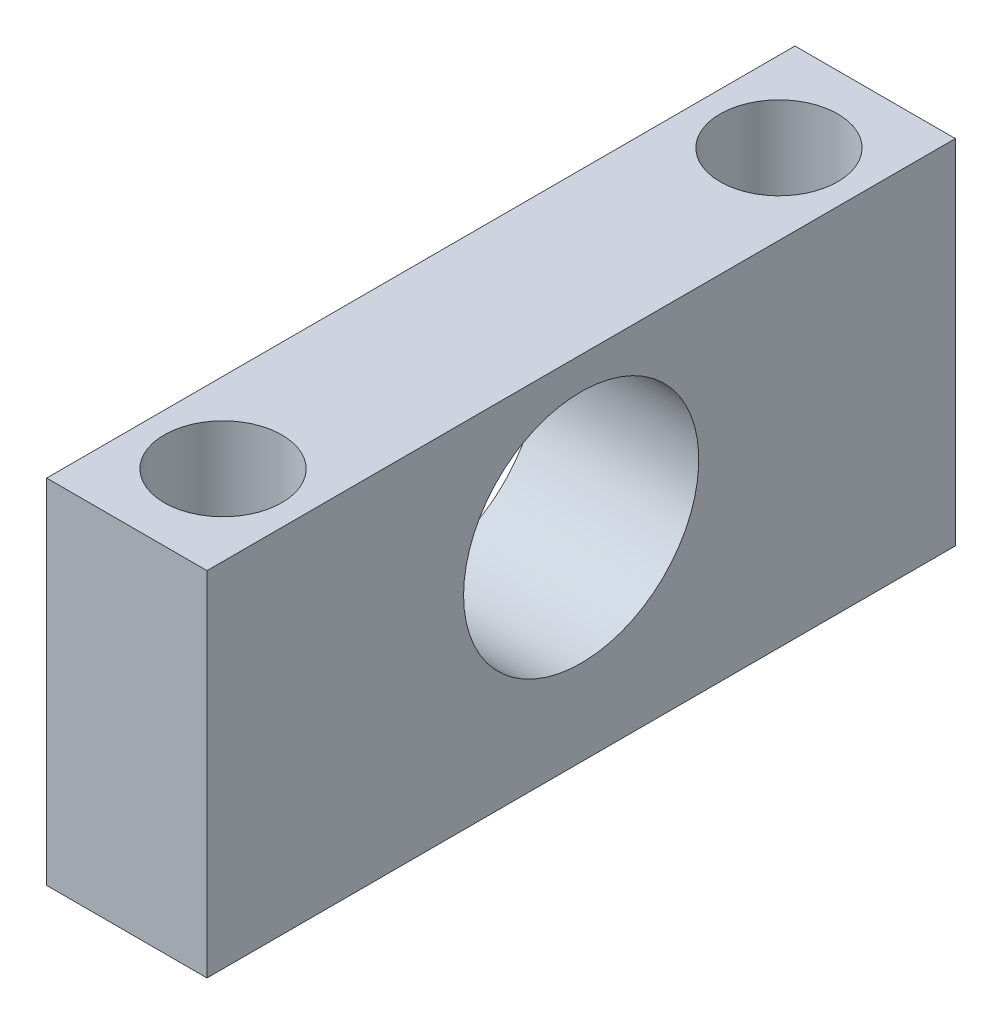
ISO-10303-21;
HEADER;
FILE_DESCRIPTION(('STEP AP214'),'2;1');
FILE_NAME('part.step','',(''),(''),'','','');
FILE_SCHEMA(('AUTOMOTIVE_DESIGN { 1 0 10303 214 1 1 1 1 }'));
ENDSEC;
DATA;
#1=APPLICATION_CONTEXT('core data for automotive mechanical design processes');
#2=APPLICATION_PROTOCOL_DEFINITION('international standard','automotive_design',2000,#1);
#3=PRODUCT_CONTEXT('',#1,'mechanical');
#4=PRODUCT('Part','Part','',(#3));
#5=PRODUCT_RELATED_PRODUCT_CATEGORY('part','',(#4));
#6=PRODUCT_DEFINITION_FORMATION('','',#4);
#7=PRODUCT_DEFINITION_CONTEXT('part definition',#1,'design');
#8=PRODUCT_DEFINITION('design','',#6,#7);
#9=PRODUCT_DEFINITION_SHAPE('','',#8);
#10=(LENGTH_UNIT() NAMED_UNIT(*) SI_UNIT(.MILLI.,.METRE.));
#11=(NAMED_UNIT(*) PLANE_ANGLE_UNIT() SI_UNIT($,.RADIAN.));
#12=(NAMED_UNIT(*) SI_UNIT($,.STERADIAN.) SOLID_ANGLE_UNIT());
#13=UNCERTAINTY_MEASURE_WITH_UNIT(LENGTH_MEASURE(1.E-05),#10,'distance_accuracy_value','');
#14=(GEOMETRIC_REPRESENTATION_CONTEXT(3) GLOBAL_UNCERTAINTY_ASSIGNED_CONTEXT((#13)) GLOBAL_UNIT_ASSIGNED_CONTEXT((#10,
#11,#12)) REPRESENTATION_CONTEXT('',''));
#15=CARTESIAN_POINT('',(0.,0.,0.));
#16=DIRECTION('',(0.,0.,1.));
#17=DIRECTION('',(1.,0.,0.));
#18=AXIS2_PLACEMENT_3D('',#15,#16,#17);
#19=CARTESIAN_POINT('',(0.,0.,35.));
#20=DIRECTION('',(0.,0.,1.));
#21=DIRECTION('',(1.,0.,0.));
#22=AXIS2_PLACEMENT_3D('',#19,#20,#21);
#23=PLANE('',#22);
#24=DIRECTION('',(1.,0.,0.));
#25=VECTOR('',#24,1.);
#26=CARTESIAN_POINT('',(0.,14.,35.));
#27=LINE('',#26,#25);
#28=CARTESIAN_POINT('',(2.5,14.,35.));
#29=VERTEX_POINT('',#28);
#30=CARTESIAN_POINT('',(17.5,14.,35.));
#31=VERTEX_POINT('',#30);
#32=EDGE_CURVE('E70',#29,#31,#27,.T.);
#33=ORIENTED_EDGE('',*,*,#32,.F.);
#34=DIRECTION('',(0.,-1.,0.));
#35=VECTOR('',#34,1.);
#36=CARTESIAN_POINT('',(2.5,17.5,35.));
#37=LINE('',#36,#35);
#38=CARTESIAN_POINT('',(2.5,-19.,35.));
#39=VERTEX_POINT('',#38);
#40=EDGE_CURVE('E63',#29,#39,#37,.T.);
#41=ORIENTED_EDGE('',*,*,#40,.T.);
#42=DIRECTION('',(-1.,0.,0.));
#43=VECTOR('',#42,1.);
#44=CARTESIAN_POINT('',(0.,-19.,35.));
#45=LINE('',#44,#43);
#46=CARTESIAN_POINT('',(17.5,-19.,35.));
#47=VERTEX_POINT('',#46);
#48=EDGE_CURVE('E77',#47,#39,#45,.T.);
#49=ORIENTED_EDGE('',*,*,#48,.F.);
#50=DIRECTION('',(0.,-1.,0.));
#51=VECTOR('',#50,1.);
#52=CARTESIAN_POINT('',(17.5,0.,35.));
#53=LINE('',#52,#51);
#54=EDGE_CURVE('E86',#31,#47,#53,.T.);
#55=ORIENTED_EDGE('',*,*,#54,.F.);
#56=EDGE_LOOP('',(#33,#41,#49,#55));
#57=FACE_BOUND('',#56,.T.);
#58=ADVANCED_FACE('F17',(#57),#23,.T.);
#59=CARTESIAN_POINT('',(0.,0.,-35.));
#60=DIRECTION('',(0.,0.,1.));
#61=DIRECTION('',(1.,0.,0.));
#62=AXIS2_PLACEMENT_3D('',#59,#60,#61);
#63=PLANE('',#62);
#64=DIRECTION('',(1.,0.,0.));
#65=VECTOR('',#64,1.);
#66=CARTESIAN_POINT('',(0.,14.,-35.));
#67=LINE('',#66,#65);
#68=CARTESIAN_POINT('',(2.5,14.,-35.));
#69=VERTEX_POINT('',#68);
#70=CARTESIAN_POINT('',(17.5,14.,-35.));
#71=VERTEX_POINT('',#70);
#72=EDGE_CURVE('E67',#69,#71,#67,.T.);
#73=ORIENTED_EDGE('',*,*,#72,.T.);
#74=DIRECTION('',(0.,-1.,0.));
#75=VECTOR('',#74,1.);
#76=CARTESIAN_POINT('',(17.5,0.,-35.));
#77=LINE('',#76,#75);
#78=CARTESIAN_POINT('',(17.5,-19.,-35.));
#79=VERTEX_POINT('',#78);
#80=EDGE_CURVE('E21',#71,#79,#77,.T.);
#81=ORIENTED_EDGE('',*,*,#80,.T.);
#82=DIRECTION('',(-1.,0.,0.));
#83=VECTOR('',#82,1.);
#84=CARTESIAN_POINT('',(0.,-19.,-35.));
#85=LINE('',#84,#83);
#86=CARTESIAN_POINT('',(2.5,-19.,-35.));
#87=VERTEX_POINT('',#86);
#88=EDGE_CURVE('E42',#79,#87,#85,.T.);
#89=ORIENTED_EDGE('',*,*,#88,.T.);
#90=DIRECTION('',(0.,-1.,0.));
#91=VECTOR('',#90,1.);
#92=CARTESIAN_POINT('',(2.5,17.5,-35.));
#93=LINE('',#92,#91);
#94=EDGE_CURVE('E72',#69,#87,#93,.T.);
#95=ORIENTED_EDGE('',*,*,#94,.F.);
#96=EDGE_LOOP('',(#73,#81,#89,#95));
#97=FACE_BOUND('',#96,.T.);
#98=ADVANCED_FACE('F73',(#97),#63,.F.);
#99=CARTESIAN_POINT('',(0.5,-19.,35.));
#100=DIRECTION('',(0.,1.,0.));
#101=DIRECTION('',(0.,0.,1.));
#102=AXIS2_PLACEMENT_3D('',#99,#100,#101);
#103=PLANE('',#102);
#104=CARTESIAN_POINT('',(10.,-19.,-26.));
#105=DIRECTION('',(0.,1.,0.));
#106=DIRECTION('',(0.,0.,1.));
#107=AXIS2_PLACEMENT_3D('',#104,#105,#106);
#108=CIRCLE('',#107,3.3);
#109=CARTESIAN_POINT('',(10.,-19.,-22.7));
#110=VERTEX_POINT('',#109);
#111=EDGE_CURVE('E179',#110,#110,#108,.T.);
#112=ORIENTED_EDGE('',*,*,#111,.T.);
#113=EDGE_LOOP('',(#112));
#114=FACE_BOUND('',#113,.T.);
#115=CARTESIAN_POINT('',(10.,-19.,26.));
#116=DIRECTION('',(0.,1.,0.));
#117=DIRECTION('',(0.,0.,1.));
#118=AXIS2_PLACEMENT_3D('',#115,#116,#117);
#119=CIRCLE('',#118,3.3);
#120=CARTESIAN_POINT('',(10.,-19.,29.3));
#121=VERTEX_POINT('',#120);
#122=EDGE_CURVE('E75',#121,#121,#119,.T.);
#123=ORIENTED_EDGE('',*,*,#122,.T.);
#124=EDGE_LOOP('',(#123));
#125=FACE_BOUND('',#124,.T.);
#126=ORIENTED_EDGE('',*,*,#88,.F.);
#127=DIRECTION('',(0.,0.,1.));
#128=VECTOR('',#127,1.);
#129=CARTESIAN_POINT('',(17.5,-19.,35.));
#130=LINE('',#129,#128);
#131=EDGE_CURVE('E34',#79,#47,#130,.T.);
#132=ORIENTED_EDGE('',*,*,#131,.T.);
#133=ORIENTED_EDGE('',*,*,#48,.T.);
#134=DIRECTION('',(0.,0.,-1.));
#135=VECTOR('',#134,1.);
#136=CARTESIAN_POINT('',(2.5,-19.,35.));
#137=LINE('',#136,#135);
#138=EDGE_CURVE('E89',#39,#87,#137,.T.);
#139=ORIENTED_EDGE('',*,*,#138,.T.);
#140=EDGE_LOOP('',(#126,#132,#133,#139));
#141=FACE_BOUND('',#140,.T.);
#142=ADVANCED_FACE('F99',(#114,#125,#141),#103,.F.);
#143=CARTESIAN_POINT('',(19.5,14.,35.));
#144=DIRECTION('',(0.,-1.,0.));
#145=DIRECTION('',(0.,0.,-1.));
#146=AXIS2_PLACEMENT_3D('',#143,#144,#145);
#147=PLANE('',#146);
#148=CARTESIAN_POINT('',(10.,14.,-26.));
#149=DIRECTION('',(0.,1.,0.));
#150=DIRECTION('',(0.,0.,1.));
#151=AXIS2_PLACEMENT_3D('',#148,#149,#150);
#152=CIRCLE('',#151,5.5);
#153=CARTESIAN_POINT('',(10.,14.,-20.5));
#154=VERTEX_POINT('',#153);
#155=EDGE_CURVE('E172',#154,#154,#152,.T.);
#156=ORIENTED_EDGE('',*,*,#155,.F.);
#157=EDGE_LOOP('',(#156));
#158=FACE_BOUND('',#157,.T.);
#159=CARTESIAN_POINT('',(10.,14.,26.));
#160=DIRECTION('',(0.,1.,0.));
#161=DIRECTION('',(0.,0.,1.));
#162=AXIS2_PLACEMENT_3D('',#159,#160,#161);
#163=CIRCLE('',#162,5.5);
#164=CARTESIAN_POINT('',(10.,14.,31.5));
#165=VERTEX_POINT('',#164);
#166=EDGE_CURVE('E182',#165,#165,#163,.T.);
#167=ORIENTED_EDGE('',*,*,#166,.F.);
#168=EDGE_LOOP('',(#167));
#169=FACE_BOUND('',#168,.T.);
#170=ORIENTED_EDGE('',*,*,#72,.F.);
#171=DIRECTION('',(0.,0.,1.));
#172=VECTOR('',#171,1.);
#173=CARTESIAN_POINT('',(2.5,14.,35.));
#174=LINE('',#173,#172);
#175=EDGE_CURVE('E71',#69,#29,#174,.T.);
#176=ORIENTED_EDGE('',*,*,#175,.T.);
#177=ORIENTED_EDGE('',*,*,#32,.T.);
#178=DIRECTION('',(0.,0.,-1.));
#179=VECTOR('',#178,1.);
#180=CARTESIAN_POINT('',(17.5,14.,35.));
#181=LINE('',#180,#179);
#182=EDGE_CURVE('E60',#31,#71,#181,.T.);
#183=ORIENTED_EDGE('',*,*,#182,.T.);
#184=EDGE_LOOP('',(#170,#176,#177,#183));
#185=FACE_BOUND('',#184,.T.);
#186=ADVANCED_FACE('F65',(#158,#169,#185),#147,.F.);
#187=CARTESIAN_POINT('',(2.5,17.5,35.));
#188=DIRECTION('',(1.,0.,0.));
#189=DIRECTION('',(0.,0.,-1.));
#190=AXIS2_PLACEMENT_3D('',#187,#188,#189);
#191=PLANE('',#190);
#192=CARTESIAN_POINT('',(2.5,0.,0.));
#193=DIRECTION('',(1.,0.,0.));
#194=DIRECTION('',(0.,0.,-1.));
#195=AXIS2_PLACEMENT_3D('',#192,#193,#194);
#196=CIRCLE('',#195,11.);
#197=CARTESIAN_POINT('',(2.5,0.,-11.));
#198=VERTEX_POINT('',#197);
#199=EDGE_CURVE('E26',#198,#198,#196,.F.);
#200=ORIENTED_EDGE('',*,*,#199,.F.);
#201=EDGE_LOOP('',(#200));
#202=FACE_BOUND('',#201,.T.);
#203=ORIENTED_EDGE('',*,*,#138,.F.);
#204=ORIENTED_EDGE('',*,*,#40,.F.);
#205=ORIENTED_EDGE('',*,*,#175,.F.);
#206=ORIENTED_EDGE('',*,*,#94,.T.);
#207=EDGE_LOOP('',(#203,#204,#205,#206));
#208=FACE_BOUND('',#207,.T.);
#209=ADVANCED_FACE('F102',(#202,#208),#191,.F.);
#210=CARTESIAN_POINT('',(17.5,-17.5,35.));
#211=DIRECTION('',(-1.,0.,0.));
#212=DIRECTION('',(0.,0.,1.));
#213=AXIS2_PLACEMENT_3D('',#210,#211,#212);
#214=PLANE('',#213);
#215=CARTESIAN_POINT('',(17.5,0.,0.));
#216=DIRECTION('',(-1.,0.,0.));
#217=DIRECTION('',(0.,0.,1.));
#218=AXIS2_PLACEMENT_3D('',#215,#216,#217);
#219=CIRCLE('',#218,11.);
#220=CARTESIAN_POINT('',(17.5,0.,11.));
#221=VERTEX_POINT('',#220);
#222=EDGE_CURVE('E11',#221,#221,#219,.F.);
#223=ORIENTED_EDGE('',*,*,#222,.F.);
#224=EDGE_LOOP('',(#223));
#225=FACE_BOUND('',#224,.T.);
#226=ORIENTED_EDGE('',*,*,#131,.F.);
#227=ORIENTED_EDGE('',*,*,#80,.F.);
#228=ORIENTED_EDGE('',*,*,#182,.F.);
#229=ORIENTED_EDGE('',*,*,#54,.T.);
#230=EDGE_LOOP('',(#226,#227,#228,#229));
#231=FACE_BOUND('',#230,.T.);
#232=ADVANCED_FACE('F19',(#225,#231),#214,.F.);
#233=CARTESIAN_POINT('',(20.,0.,0.));
#234=DIRECTION('',(-1.,0.,0.));
#235=DIRECTION('',(0.,0.,1.));
#236=AXIS2_PLACEMENT_3D('',#233,#234,#235);
#237=CYLINDRICAL_SURFACE('',#236,11.);
#238=ORIENTED_EDGE('',*,*,#199,.T.);
#239=EDGE_LOOP('',(#238));
#240=FACE_BOUND('',#239,.T.);
#241=ORIENTED_EDGE('',*,*,#222,.T.);
#242=EDGE_LOOP('',(#241));
#243=FACE_BOUND('',#242,.T.);
#244=ADVANCED_FACE('F111',(#240,#243),#237,.F.);
#245=CARTESIAN_POINT('',(10.,14.,26.));
#246=DIRECTION('',(0.,1.,0.));
#247=DIRECTION('',(0.,0.,1.));
#248=AXIS2_PLACEMENT_3D('',#245,#246,#247);
#249=CYLINDRICAL_SURFACE('',#248,3.3);
#250=ORIENTED_EDGE('',*,*,#122,.F.);
#251=EDGE_LOOP('',(#250));
#252=FACE_BOUND('',#251,.T.);
#253=CARTESIAN_POINT('',(10.,4.,26.));
#254=DIRECTION('',(0.,1.,0.));
#255=DIRECTION('',(0.,0.,1.));
#256=AXIS2_PLACEMENT_3D('',#253,#254,#255);
#257=CIRCLE('',#256,3.3);
#258=CARTESIAN_POINT('',(10.,4.,29.3));
#259=VERTEX_POINT('',#258);
#260=EDGE_CURVE('E80',#259,#259,#257,.T.);
#261=ORIENTED_EDGE('',*,*,#260,.T.);
#262=EDGE_LOOP('',(#261));
#263=FACE_BOUND('',#262,.T.);
#264=ADVANCED_FACE('F129',(#252,#263),#249,.F.);
#265=CARTESIAN_POINT('',(13.3,4.,26.));
#266=DIRECTION('',(0.,-1.,0.));
#267=DIRECTION('',(0.,0.,-1.));
#268=AXIS2_PLACEMENT_3D('',#265,#266,#267);
#269=PLANE('',#268);
#270=ORIENTED_EDGE('',*,*,#260,.F.);
#271=EDGE_LOOP('',(#270));
#272=FACE_BOUND('',#271,.T.);
#273=CARTESIAN_POINT('',(10.,4.,26.));
#274=DIRECTION('',(0.,1.,0.));
#275=DIRECTION('',(0.,0.,1.));
#276=AXIS2_PLACEMENT_3D('',#273,#274,#275);
#277=CIRCLE('',#276,5.5);
#278=CARTESIAN_POINT('',(10.,4.,31.5));
#279=VERTEX_POINT('',#278);
#280=EDGE_CURVE('E185',#279,#279,#277,.T.);
#281=ORIENTED_EDGE('',*,*,#280,.T.);
#282=EDGE_LOOP('',(#281));
#283=FACE_BOUND('',#282,.T.);
#284=ADVANCED_FACE('F135',(#272,#283),#269,.F.);
#285=CARTESIAN_POINT('',(10.,14.,26.));
#286=DIRECTION('',(0.,1.,0.));
#287=DIRECTION('',(0.,0.,1.));
#288=AXIS2_PLACEMENT_3D('',#285,#286,#287);
#289=CYLINDRICAL_SURFACE('',#288,5.5);
#290=ORIENTED_EDGE('',*,*,#280,.F.);
#291=EDGE_LOOP('',(#290));
#292=FACE_BOUND('',#291,.T.);
#293=ORIENTED_EDGE('',*,*,#166,.T.);
#294=EDGE_LOOP('',(#293));
#295=FACE_BOUND('',#294,.T.);
#296=ADVANCED_FACE('F143',(#292,#295),#289,.F.);
#297=CARTESIAN_POINT('',(10.,14.,-26.));
#298=DIRECTION('',(0.,1.,0.));
#299=DIRECTION('',(0.,0.,1.));
#300=AXIS2_PLACEMENT_3D('',#297,#298,#299);
#301=CYLINDRICAL_SURFACE('',#300,3.3);
#302=ORIENTED_EDGE('',*,*,#111,.F.);
#303=EDGE_LOOP('',(#302));
#304=FACE_BOUND('',#303,.T.);
#305=CARTESIAN_POINT('',(10.,4.,-26.));
#306=DIRECTION('',(0.,1.,0.));
#307=DIRECTION('',(0.,0.,1.));
#308=AXIS2_PLACEMENT_3D('',#305,#306,#307);
#309=CIRCLE('',#308,3.3);
#310=CARTESIAN_POINT('',(10.,4.,-22.7));
#311=VERTEX_POINT('',#310);
#312=EDGE_CURVE('E174',#311,#311,#309,.T.);
#313=ORIENTED_EDGE('',*,*,#312,.T.);
#314=EDGE_LOOP('',(#313));
#315=FACE_BOUND('',#314,.T.);
#316=ADVANCED_FACE('F151',(#304,#315),#301,.F.);
#317=CARTESIAN_POINT('',(13.3,4.,-26.));
#318=DIRECTION('',(0.,-1.,0.));
#319=DIRECTION('',(0.,0.,-1.));
#320=AXIS2_PLACEMENT_3D('',#317,#318,#319);
#321=PLANE('',#320);
#322=ORIENTED_EDGE('',*,*,#312,.F.);
#323=EDGE_LOOP('',(#322));
#324=FACE_BOUND('',#323,.T.);
#325=CARTESIAN_POINT('',(10.,4.,-26.));
#326=DIRECTION('',(0.,1.,0.));
#327=DIRECTION('',(0.,0.,1.));
#328=AXIS2_PLACEMENT_3D('',#325,#326,#327);
#329=CIRCLE('',#328,5.5);
#330=CARTESIAN_POINT('',(10.,4.,-20.5));
#331=VERTEX_POINT('',#330);
#332=EDGE_CURVE('E169',#331,#331,#329,.T.);
#333=ORIENTED_EDGE('',*,*,#332,.T.);
#334=EDGE_LOOP('',(#333));
#335=FACE_BOUND('',#334,.T.);
#336=ADVANCED_FACE('F155',(#324,#335),#321,.F.);
#337=CARTESIAN_POINT('',(10.,14.,-26.));
#338=DIRECTION('',(0.,1.,0.));
#339=DIRECTION('',(0.,0.,1.));
#340=AXIS2_PLACEMENT_3D('',#337,#338,#339);
#341=CYLINDRICAL_SURFACE('',#340,5.5);
#342=ORIENTED_EDGE('',*,*,#332,.F.);
#343=EDGE_LOOP('',(#342));
#344=FACE_BOUND('',#343,.T.);
#345=ORIENTED_EDGE('',*,*,#155,.T.);
#346=EDGE_LOOP('',(#345));
#347=FACE_BOUND('',#346,.T.);
#348=ADVANCED_FACE('F159',(#344,#347),#341,.F.);
#349=CLOSED_SHELL('',(#58,#98,#142,#186,#209,#232,#244,#264,#284,#296,#316,#336,#348));
#350=MANIFOLD_SOLID_BREP('B1',#349);
#351=ADVANCED_BREP_SHAPE_REPRESENTATION('',(#18,#350),#14);
#352=SHAPE_DEFINITION_REPRESENTATION(#9,#351);
ENDSEC;
END-ISO-10303-21;
